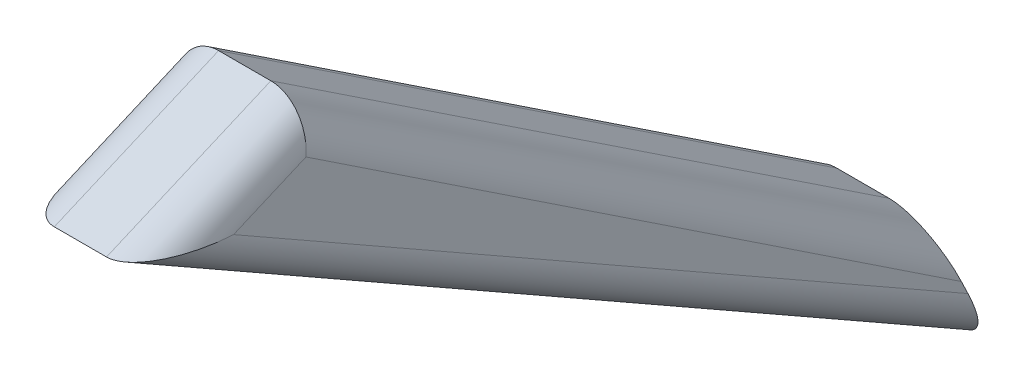
ISO-10303-21;
HEADER;
FILE_DESCRIPTION(('STEP AP214'),'2;1');
FILE_NAME('part.step','',(''),(''),'','','');
FILE_SCHEMA(('AUTOMOTIVE_DESIGN { 1 0 10303 214 1 1 1 1 }'));
ENDSEC;
DATA;
#1=APPLICATION_CONTEXT('core data for automotive mechanical design processes');
#2=APPLICATION_PROTOCOL_DEFINITION('international standard','automotive_design',2000,#1);
#3=PRODUCT_CONTEXT('',#1,'mechanical');
#4=PRODUCT('Part','Part','',(#3));
#5=PRODUCT_RELATED_PRODUCT_CATEGORY('part','',(#4));
#6=PRODUCT_DEFINITION_FORMATION('','',#4);
#7=PRODUCT_DEFINITION_CONTEXT('part definition',#1,'design');
#8=PRODUCT_DEFINITION('design','',#6,#7);
#9=PRODUCT_DEFINITION_SHAPE('','',#8);
#10=(LENGTH_UNIT() NAMED_UNIT(*) SI_UNIT(.MILLI.,.METRE.));
#11=(NAMED_UNIT(*) PLANE_ANGLE_UNIT() SI_UNIT($,.RADIAN.));
#12=(NAMED_UNIT(*) SI_UNIT($,.STERADIAN.) SOLID_ANGLE_UNIT());
#13=UNCERTAINTY_MEASURE_WITH_UNIT(LENGTH_MEASURE(1.E-05),#10,'distance_accuracy_value','');
#14=(GEOMETRIC_REPRESENTATION_CONTEXT(3) GLOBAL_UNCERTAINTY_ASSIGNED_CONTEXT((#13)) GLOBAL_UNIT_ASSIGNED_CONTEXT((#10,
#11,#12)) REPRESENTATION_CONTEXT('',''));
#15=CARTESIAN_POINT('',(0.,0.,0.));
#16=DIRECTION('',(0.,0.,1.));
#17=DIRECTION('',(1.,0.,0.));
#18=AXIS2_PLACEMENT_3D('',#15,#16,#17);
#19=CARTESIAN_POINT('',(0.5,-1.8577297692006,-3.26181573954087));
#20=DIRECTION('',(0.,0.868949730491322,-0.494900359546302));
#21=DIRECTION('',(0.,0.494900359546302,0.868949730491322));
#22=AXIS2_PLACEMENT_3D('',#19,#20,#21);
#23=PLANE('',#22);
#24=DIRECTION('',(-1.,0.,0.));
#25=VECTOR('',#24,1.);
#26=CARTESIAN_POINT('',(0.5,0.,0.));
#27=LINE('',#26,#25);
#28=CARTESIAN_POINT('',(0.35,0.,0.));
#29=VERTEX_POINT('',#28);
#30=CARTESIAN_POINT('',(0.15,0.,0.));
#31=VERTEX_POINT('',#30);
#32=EDGE_CURVE('E198',#29,#31,#27,.T.);
#33=ORIENTED_EDGE('',*,*,#32,.T.);
#34=DIRECTION('',(0.,-0.494900359546302,-0.868949730491322));
#35=VECTOR('',#34,1.);
#36=CARTESIAN_POINT('',(0.15,-1.8577297692006,-3.26181573954087));
#37=LINE('',#36,#35);
#38=CARTESIAN_POINT('',(0.15,-1.8577297692006,-3.26181573954087));
#39=VERTEX_POINT('',#38);
#40=EDGE_CURVE('E126',#31,#39,#37,.T.);
#41=ORIENTED_EDGE('',*,*,#40,.T.);
#42=DIRECTION('',(-1.,0.,0.));
#43=VECTOR('',#42,1.);
#44=CARTESIAN_POINT('',(0.5,-1.8577297692006,-3.26181573954087));
#45=LINE('',#44,#43);
#46=CARTESIAN_POINT('',(0.35,-1.8577297692006,-3.26181573954087));
#47=VERTEX_POINT('',#46);
#48=EDGE_CURVE('E110',#47,#39,#45,.T.);
#49=ORIENTED_EDGE('',*,*,#48,.F.);
#50=DIRECTION('',(0.,-0.494900359546302,-0.868949730491322));
#51=VECTOR('',#50,1.);
#52=CARTESIAN_POINT('',(0.35,-1.8577297692006,-3.26181573954087));
#53=LINE('',#52,#51);
#54=EDGE_CURVE('E124',#47,#29,#53,.F.);
#55=ORIENTED_EDGE('',*,*,#54,.T.);
#56=EDGE_LOOP('',(#33,#41,#49,#55));
#57=FACE_BOUND('',#56,.T.);
#58=ADVANCED_FACE('F39',(#57),#23,.F.);
#59=CARTESIAN_POINT('',(0.5,-1.30308375493358,-2.9955856526927));
#60=DIRECTION('',(0.,-0.432731067584771,0.901523057468274));
#61=DIRECTION('',(0.,-0.901523057468274,-0.432731067584771));
#62=AXIS2_PLACEMENT_3D('',#59,#60,#61);
#63=PLANE('',#62);
#64=ORIENTED_EDGE('',*,*,#48,.T.);
#65=CARTESIAN_POINT('',(0.15,-1.62016153961046,-3.14778298933761));
#66=DIRECTION('',(0.,-0.432731067584771,0.901523057468274));
#67=DIRECTION('',(0.,0.901523057468274,0.432731067584771));
#68=AXIS2_PLACEMENT_3D('',#65,#66,#67);
#69=ELLIPSE('',#68,0.263518750432511,0.15);
#70=CARTESIAN_POINT('',(0.,-1.62016153961046,-3.14778298933761));
#71=VERTEX_POINT('',#70);
#72=EDGE_CURVE('E118',#39,#71,#69,.F.);
#73=ORIENTED_EDGE('',*,*,#72,.T.);
#74=DIRECTION('',(0.,0.901523057468274,0.432731067584771));
#75=VECTOR('',#74,1.);
#76=CARTESIAN_POINT('',(0.,-1.30308375493358,-2.9955856526927));
#77=LINE('',#76,#75);
#78=CARTESIAN_POINT('',(0.,-1.56755425075382,-3.12253149068642));
#79=VERTEX_POINT('',#78);
#80=EDGE_CURVE('E179',#71,#79,#77,.T.);
#81=ORIENTED_EDGE('',*,*,#80,.T.);
#82=CARTESIAN_POINT('',(0.15,-1.56755425075382,-3.12253149068642));
#83=DIRECTION('',(0.,-0.432731067584771,0.901523057468274));
#84=DIRECTION('',(0.,-0.901523057468274,-0.432731067584771));
#85=AXIS2_PLACEMENT_3D('',#82,#83,#84);
#86=ELLIPSE('',#85,0.293359658002485,0.15);
#87=CARTESIAN_POINT('',(0.15,-1.30308375493358,-2.9955856526927));
#88=VERTEX_POINT('',#87);
#89=EDGE_CURVE('E119',#79,#88,#86,.F.);
#90=ORIENTED_EDGE('',*,*,#89,.T.);
#91=DIRECTION('',(-1.,0.,0.));
#92=VECTOR('',#91,1.);
#93=CARTESIAN_POINT('',(0.5,-1.30308375493358,-2.9955856526927));
#94=LINE('',#93,#92);
#95=CARTESIAN_POINT('',(0.35,-1.30308375493358,-2.9955856526927));
#96=VERTEX_POINT('',#95);
#97=EDGE_CURVE('E128',#96,#88,#94,.T.);
#98=ORIENTED_EDGE('',*,*,#97,.F.);
#99=CARTESIAN_POINT('',(0.35,-1.56755425075382,-3.12253149068642));
#100=DIRECTION('',(0.,-0.432731067584771,0.901523057468274));
#101=DIRECTION('',(0.,0.901523057468274,0.432731067584771));
#102=AXIS2_PLACEMENT_3D('',#99,#100,#101);
#103=ELLIPSE('',#102,0.293359658002485,0.15);
#104=CARTESIAN_POINT('',(0.5,-1.56755425075382,-3.12253149068642));
#105=VERTEX_POINT('',#104);
#106=EDGE_CURVE('E137',#96,#105,#103,.F.);
#107=ORIENTED_EDGE('',*,*,#106,.T.);
#108=DIRECTION('',(0.,0.901523057468274,0.432731067584771));
#109=VECTOR('',#108,1.);
#110=CARTESIAN_POINT('',(0.5,-1.30308375493358,-2.9955856526927));
#111=LINE('',#110,#109);
#112=CARTESIAN_POINT('',(0.5,-1.62016153961046,-3.14778298933761));
#113=VERTEX_POINT('',#112);
#114=EDGE_CURVE('E112',#113,#105,#111,.T.);
#115=ORIENTED_EDGE('',*,*,#114,.F.);
#116=CARTESIAN_POINT('',(0.35,-1.62016153961046,-3.14778298933761));
#117=DIRECTION('',(0.,-0.432731067584771,0.901523057468274));
#118=DIRECTION('',(0.,-0.901523057468274,-0.432731067584771));
#119=AXIS2_PLACEMENT_3D('',#116,#117,#118);
#120=ELLIPSE('',#119,0.263518750432511,0.15);
#121=EDGE_CURVE('E107',#113,#47,#120,.F.);
#122=ORIENTED_EDGE('',*,*,#121,.T.);
#123=EDGE_LOOP('',(#64,#73,#81,#90,#98,#107,#115,#122));
#124=FACE_BOUND('',#123,.T.);
#125=ADVANCED_FACE('F109',(#124),#63,.F.);
#126=CARTESIAN_POINT('',(0.5,0.26964583218803,-0.629095991820067));
#127=DIRECTION('',(0.,-0.832850244778622,0.55349839184246));
#128=DIRECTION('',(0.,-0.55349839184246,-0.832850244778622));
#129=AXIS2_PLACEMENT_3D('',#126,#127,#128);
#130=PLANE('',#129);
#131=ORIENTED_EDGE('',*,*,#97,.T.);
#132=DIRECTION('',(0.,0.55349839184246,0.832850244778622));
#133=VECTOR('',#132,1.);
#134=CARTESIAN_POINT('',(0.15,0.26964583218803,-0.629095991820067));
#135=LINE('',#134,#133);
#136=CARTESIAN_POINT('',(0.15,0.26964583218803,-0.629095991820067));
#137=VERTEX_POINT('',#136);
#138=EDGE_CURVE('E57',#88,#137,#135,.T.);
#139=ORIENTED_EDGE('',*,*,#138,.T.);
#140=DIRECTION('',(-1.,0.,0.));
#141=VECTOR('',#140,1.);
#142=CARTESIAN_POINT('',(0.5,0.26964583218803,-0.629095991820067));
#143=LINE('',#142,#141);
#144=CARTESIAN_POINT('',(0.35,0.26964583218803,-0.629095991820067));
#145=VERTEX_POINT('',#144);
#146=EDGE_CURVE('E193',#145,#137,#143,.T.);
#147=ORIENTED_EDGE('',*,*,#146,.F.);
#148=DIRECTION('',(0.,0.55349839184246,0.832850244778622));
#149=VECTOR('',#148,1.);
#150=CARTESIAN_POINT('',(0.35,0.26964583218803,-0.629095991820067));
#151=LINE('',#150,#149);
#152=EDGE_CURVE('E165',#145,#96,#151,.F.);
#153=ORIENTED_EDGE('',*,*,#152,.T.);
#154=EDGE_LOOP('',(#131,#139,#147,#153));
#155=FACE_BOUND('',#154,.T.);
#156=ADVANCED_FACE('F192',(#155),#130,.F.);
#157=CARTESIAN_POINT('',(0.5,0.,0.));
#158=DIRECTION('',(0.,-0.919127432530047,-0.393960356851706));
#159=DIRECTION('',(0.,0.393960356851706,-0.919127432530047));
#160=AXIS2_PLACEMENT_3D('',#157,#158,#159);
#161=PLANE('',#160);
#162=ORIENTED_EDGE('',*,*,#146,.T.);
#163=DIRECTION('',(0.,-0.393960356851706,0.919127432530047));
#164=VECTOR('',#163,1.);
#165=CARTESIAN_POINT('',(0.15,0.,0.));
#166=LINE('',#165,#164);
#167=EDGE_CURVE('E11',#137,#31,#166,.T.);
#168=ORIENTED_EDGE('',*,*,#167,.T.);
#169=ORIENTED_EDGE('',*,*,#32,.F.);
#170=DIRECTION('',(0.,-0.393960356851706,0.919127432530047));
#171=VECTOR('',#170,1.);
#172=CARTESIAN_POINT('',(0.35,0.,0.));
#173=LINE('',#172,#171);
#174=EDGE_CURVE('E49',#29,#145,#173,.F.);
#175=ORIENTED_EDGE('',*,*,#174,.T.);
#176=EDGE_LOOP('',(#162,#168,#169,#175));
#177=FACE_BOUND('',#176,.T.);
#178=ADVANCED_FACE('F210',(#177),#161,.F.);
#179=CARTESIAN_POINT('',(0.5,0.,0.));
#180=DIRECTION('',(-1.,0.,0.));
#181=DIRECTION('',(0.,0.,1.));
#182=AXIS2_PLACEMENT_3D('',#179,#180,#181);
#183=PLANE('',#182);
#184=DIRECTION('',(0.,-0.393960356851706,0.919127432530047));
#185=VECTOR('',#184,1.);
#186=CARTESIAN_POINT('',(0.5,-0.137869114879507,-0.0590940535277559));
#187=LINE('',#186,#185);
#188=CARTESIAN_POINT('',(0.5,0.0998190167419934,-0.613631276272653));
#189=VERTEX_POINT('',#188);
#190=CARTESIAN_POINT('',(0.5,-0.0189925286675128,-0.336438536475556));
#191=VERTEX_POINT('',#190);
#192=EDGE_CURVE('E159',#189,#191,#187,.T.);
#193=ORIENTED_EDGE('',*,*,#192,.T.);
#194=DIRECTION('',(0.,-0.494900359546302,-0.868949730491322));
#195=VECTOR('',#194,1.);
#196=CARTESIAN_POINT('',(0.5,0.130342459573698,-0.0742350539319455));
#197=LINE('',#196,#195);
#198=EDGE_CURVE('E162',#191,#113,#197,.T.);
#199=ORIENTED_EDGE('',*,*,#198,.T.);
#200=ORIENTED_EDGE('',*,*,#114,.T.);
#201=DIRECTION('',(0.,0.553498391842459,0.832850244778623));
#202=VECTOR('',#201,1.);
#203=CARTESIAN_POINT('',(0.5,0.352110941622358,-0.234007063286525));
#204=LINE('',#203,#202);
#205=EDGE_CURVE('E156',#105,#189,#204,.T.);
#206=ORIENTED_EDGE('',*,*,#205,.T.);
#207=EDGE_LOOP('',(#193,#199,#200,#206));
#208=FACE_BOUND('',#207,.T.);
#209=ADVANCED_FACE('F207',(#208),#183,.F.);
#210=CARTESIAN_POINT('',(0.,0.,0.));
#211=DIRECTION('',(-1.,0.,0.));
#212=DIRECTION('',(0.,0.,1.));
#213=AXIS2_PLACEMENT_3D('',#210,#211,#212);
#214=PLANE('',#213);
#215=ORIENTED_EDGE('',*,*,#80,.F.);
#216=DIRECTION('',(0.,-0.494900359546302,-0.868949730491322));
#217=VECTOR('',#216,1.);
#218=CARTESIAN_POINT('',(0.,0.130342459573699,-0.0742350539319442));
#219=LINE('',#218,#217);
#220=CARTESIAN_POINT('',(0.,-0.0189925286675131,-0.336438536475555));
#221=VERTEX_POINT('',#220);
#222=EDGE_CURVE('E153',#71,#221,#219,.F.);
#223=ORIENTED_EDGE('',*,*,#222,.T.);
#224=DIRECTION('',(0.,-0.393960356851706,0.919127432530047));
#225=VECTOR('',#224,1.);
#226=CARTESIAN_POINT('',(0.,0.131776717308523,-0.688190045347823));
#227=LINE('',#226,#225);
#228=CARTESIAN_POINT('',(0.,0.0998190167419933,-0.613631276272653));
#229=VERTEX_POINT('',#228);
#230=EDGE_CURVE('E147',#221,#229,#227,.F.);
#231=ORIENTED_EDGE('',*,*,#230,.T.);
#232=DIRECTION('',(0.,0.553498391842459,0.832850244778623));
#233=VECTOR('',#232,1.);
#234=CARTESIAN_POINT('',(0.,-1.42801129165037,-2.91256089391633));
#235=LINE('',#234,#233);
#236=EDGE_CURVE('E150',#229,#79,#235,.F.);
#237=ORIENTED_EDGE('',*,*,#236,.T.);
#238=EDGE_LOOP('',(#215,#223,#231,#237));
#239=FACE_BOUND('',#238,.T.);
#240=ADVANCED_FACE('F209',(#239),#214,.T.);
#241=CARTESIAN_POINT('',(0.15,0.144718295471236,-0.546071233043698));
#242=DIRECTION('',(0.,-0.553498391842459,-0.832850244778622));
#243=DIRECTION('',(0.,0.832850244778622,-0.553498391842459));
#244=AXIS2_PLACEMENT_3D('',#241,#242,#243);
#245=CYLINDRICAL_SURFACE('',#244,0.15);
#246=ORIENTED_EDGE('',*,*,#89,.F.);
#247=ORIENTED_EDGE('',*,*,#236,.F.);
#248=CARTESIAN_POINT('',(0.15,0.0998190167419935,-0.613631276272653));
#249=DIRECTION('',(0.,-0.0906864622407962,-0.9958794934962));
#250=DIRECTION('',(0.,0.9958794934962,-0.0906864622407963));
#251=AXIS2_PLACEMENT_3D('',#248,#249,#250);
#252=ELLIPSE('',#251,0.170529483291026,0.15);
#253=EDGE_CURVE('E176',#137,#229,#252,.F.);
#254=ORIENTED_EDGE('',*,*,#253,.F.);
#255=ORIENTED_EDGE('',*,*,#138,.F.);
#256=EDGE_LOOP('',(#246,#247,#254,#255));
#257=FACE_BOUND('',#256,.T.);
#258=ADVANCED_FACE('F216',(#257),#245,.T.);
#259=CARTESIAN_POINT('',(0.15,-0.137869114879507,-0.0590940535277559));
#260=DIRECTION('',(0.,0.393960356851706,-0.919127432530047));
#261=DIRECTION('',(0.,0.919127432530047,0.393960356851706));
#262=AXIS2_PLACEMENT_3D('',#259,#260,#261);
#263=CYLINDRICAL_SURFACE('',#262,0.15);
#264=ORIENTED_EDGE('',*,*,#253,.T.);
#265=ORIENTED_EDGE('',*,*,#230,.F.);
#266=CARTESIAN_POINT('',(0.15,-0.0189925286675128,-0.336438536475554));
#267=DIRECTION('',(0.,0.998410400846532,-0.0563619683959675));
#268=DIRECTION('',(0.,-0.0563619683959677,-0.998410400846532));
#269=AXIS2_PLACEMENT_3D('',#266,#267,#268);
#270=ELLIPSE('',#269,0.336974190363297,0.15);
#271=EDGE_CURVE('E172',#31,#221,#270,.F.);
#272=ORIENTED_EDGE('',*,*,#271,.F.);
#273=ORIENTED_EDGE('',*,*,#167,.F.);
#274=EDGE_LOOP('',(#264,#265,#272,#273));
#275=FACE_BOUND('',#274,.T.);
#276=ADVANCED_FACE('F231',(#275),#263,.T.);
#277=CARTESIAN_POINT('',(0.15,-1.7273873096269,-3.33605079347282));
#278=DIRECTION('',(0.,0.494900359546302,0.868949730491322));
#279=DIRECTION('',(0.,-0.868949730491322,0.494900359546302));
#280=AXIS2_PLACEMENT_3D('',#277,#278,#279);
#281=CYLINDRICAL_SURFACE('',#280,0.15);
#282=ORIENTED_EDGE('',*,*,#271,.T.);
#283=ORIENTED_EDGE('',*,*,#222,.F.);
#284=ORIENTED_EDGE('',*,*,#72,.F.);
#285=ORIENTED_EDGE('',*,*,#40,.F.);
#286=EDGE_LOOP('',(#282,#283,#284,#285));
#287=FACE_BOUND('',#286,.T.);
#288=ADVANCED_FACE('F228',(#287),#281,.T.);
#289=CARTESIAN_POINT('',(0.35,0.352110941622358,-0.234007063286525));
#290=DIRECTION('',(0.,0.553498391842459,0.832850244778622));
#291=DIRECTION('',(0.,-0.832850244778622,0.553498391842459));
#292=AXIS2_PLACEMENT_3D('',#289,#290,#291);
#293=CYLINDRICAL_SURFACE('',#292,0.15);
#294=ORIENTED_EDGE('',*,*,#106,.F.);
#295=ORIENTED_EDGE('',*,*,#152,.F.);
#296=CARTESIAN_POINT('',(0.35,0.0998190167419934,-0.613631276272653));
#297=DIRECTION('',(0.,0.0906864622407962,0.9958794934962));
#298=DIRECTION('',(0.,0.9958794934962,-0.0906864622407963));
#299=AXIS2_PLACEMENT_3D('',#296,#297,#298);
#300=ELLIPSE('',#299,0.170529483291026,0.15);
#301=EDGE_CURVE('E43',#189,#145,#300,.T.);
#302=ORIENTED_EDGE('',*,*,#301,.F.);
#303=ORIENTED_EDGE('',*,*,#205,.F.);
#304=EDGE_LOOP('',(#294,#295,#302,#303));
#305=FACE_BOUND('',#304,.T.);
#306=ADVANCED_FACE('F41',(#305),#293,.T.);
#307=CARTESIAN_POINT('',(0.35,-0.137869114879507,-0.0590940535277559));
#308=DIRECTION('',(0.,-0.393960356851706,0.919127432530047));
#309=DIRECTION('',(0.,-0.919127432530047,-0.393960356851706));
#310=AXIS2_PLACEMENT_3D('',#307,#308,#309);
#311=CYLINDRICAL_SURFACE('',#310,0.15);
#312=ORIENTED_EDGE('',*,*,#301,.T.);
#313=ORIENTED_EDGE('',*,*,#174,.F.);
#314=CARTESIAN_POINT('',(0.35,-0.018992528667513,-0.336438536475555));
#315=DIRECTION('',(0.,-0.998410400846532,0.0563619683959675));
#316=DIRECTION('',(0.,0.0563619683959677,0.998410400846532));
#317=AXIS2_PLACEMENT_3D('',#314,#315,#316);
#318=ELLIPSE('',#317,0.336974190363297,0.15);
#319=EDGE_CURVE('E133',#191,#29,#318,.T.);
#320=ORIENTED_EDGE('',*,*,#319,.F.);
#321=ORIENTED_EDGE('',*,*,#192,.F.);
#322=EDGE_LOOP('',(#312,#313,#320,#321));
#323=FACE_BOUND('',#322,.T.);
#324=ADVANCED_FACE('F186',(#323),#311,.T.);
#325=CARTESIAN_POINT('',(0.35,0.130342459573698,-0.0742350539319453));
#326=DIRECTION('',(0.,-0.494900359546302,-0.868949730491322));
#327=DIRECTION('',(0.,0.868949730491322,-0.494900359546302));
#328=AXIS2_PLACEMENT_3D('',#325,#326,#327);
#329=CYLINDRICAL_SURFACE('',#328,0.15);
#330=ORIENTED_EDGE('',*,*,#319,.T.);
#331=ORIENTED_EDGE('',*,*,#54,.F.);
#332=ORIENTED_EDGE('',*,*,#121,.F.);
#333=ORIENTED_EDGE('',*,*,#198,.F.);
#334=EDGE_LOOP('',(#330,#331,#332,#333));
#335=FACE_BOUND('',#334,.T.);
#336=ADVANCED_FACE('F131',(#335),#329,.T.);
#337=CLOSED_SHELL('',(#58,#125,#156,#178,#209,#240,#258,#276,#288,#306,#324,#336));
#338=MANIFOLD_SOLID_BREP('B2',#337);
#339=ADVANCED_BREP_SHAPE_REPRESENTATION('',(#18,#338),#14);
#340=SHAPE_DEFINITION_REPRESENTATION(#9,#339);
ENDSEC;
END-ISO-10303-21;
